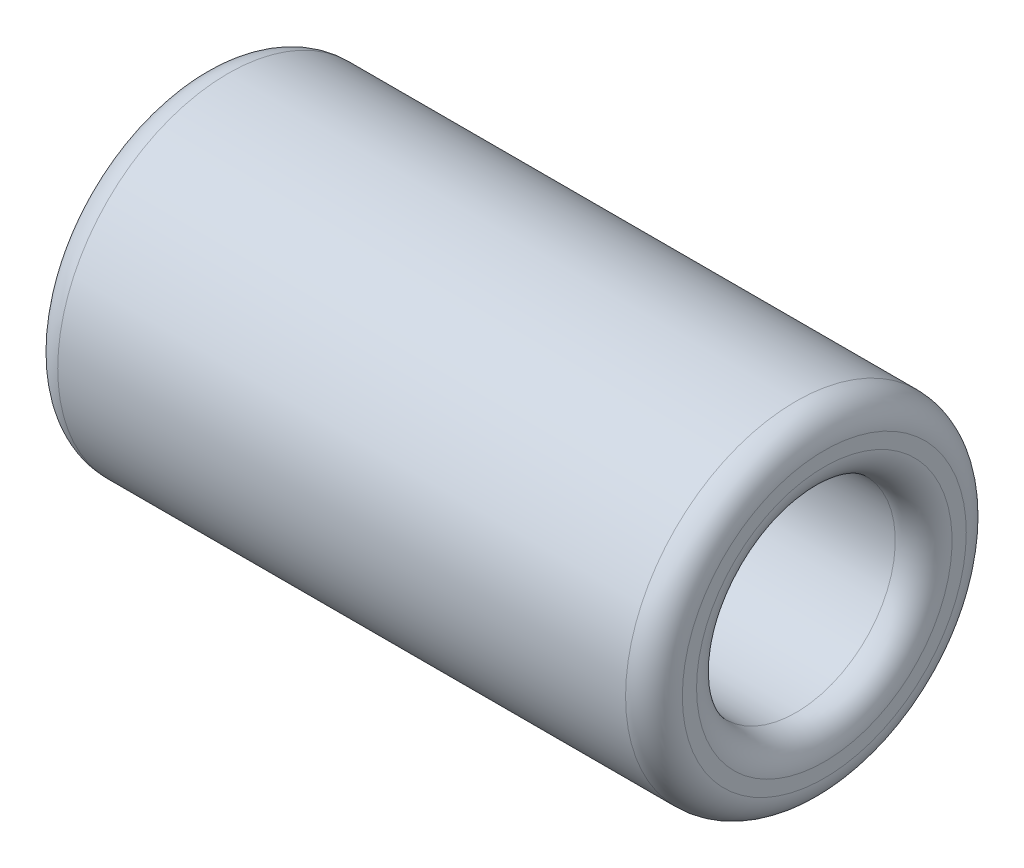
ISO-10303-21;
HEADER;
FILE_DESCRIPTION(('STEP AP214'),'2;1');
FILE_NAME('part.step','',(''),(''),'','','');
FILE_SCHEMA(('AUTOMOTIVE_DESIGN { 1 0 10303 214 1 1 1 1 }'));
ENDSEC;
DATA;
#1=APPLICATION_CONTEXT('core data for automotive mechanical design processes');
#2=APPLICATION_PROTOCOL_DEFINITION('international standard','automotive_design',2000,#1);
#3=PRODUCT_CONTEXT('',#1,'mechanical');
#4=PRODUCT('Part','Part','',(#3));
#5=PRODUCT_RELATED_PRODUCT_CATEGORY('part','',(#4));
#6=PRODUCT_DEFINITION_FORMATION('','',#4);
#7=PRODUCT_DEFINITION_CONTEXT('part definition',#1,'design');
#8=PRODUCT_DEFINITION('design','',#6,#7);
#9=PRODUCT_DEFINITION_SHAPE('','',#8);
#10=(LENGTH_UNIT() NAMED_UNIT(*) SI_UNIT(.MILLI.,.METRE.));
#11=(NAMED_UNIT(*) PLANE_ANGLE_UNIT() SI_UNIT($,.RADIAN.));
#12=(NAMED_UNIT(*) SI_UNIT($,.STERADIAN.) SOLID_ANGLE_UNIT());
#13=UNCERTAINTY_MEASURE_WITH_UNIT(LENGTH_MEASURE(1.E-05),#10,'distance_accuracy_value','');
#14=(GEOMETRIC_REPRESENTATION_CONTEXT(3) GLOBAL_UNCERTAINTY_ASSIGNED_CONTEXT((#13)) GLOBAL_UNIT_ASSIGNED_CONTEXT((#10,
#11,#12)) REPRESENTATION_CONTEXT('',''));
#15=CARTESIAN_POINT('',(0.,0.,0.));
#16=DIRECTION('',(0.,0.,1.));
#17=DIRECTION('',(1.,0.,0.));
#18=AXIS2_PLACEMENT_3D('',#15,#16,#17);
#19=CARTESIAN_POINT('',(0.,3.,0.));
#20=DIRECTION('',(1.,0.,0.));
#21=DIRECTION('',(0.,0.,-1.));
#22=AXIS2_PLACEMENT_3D('',#19,#20,#21);
#23=PLANE('',#22);
#24=CARTESIAN_POINT('',(0.,0.,0.));
#25=DIRECTION('',(1.,0.,0.));
#26=DIRECTION('',(0.,0.,-1.));
#27=AXIS2_PLACEMENT_3D('',#24,#25,#26);
#28=CIRCLE('',#27,2.5);
#29=CARTESIAN_POINT('',(0.,0.,-2.5));
#30=VERTEX_POINT('',#29);
#31=EDGE_CURVE('E53',#30,#30,#28,.F.);
#32=ORIENTED_EDGE('',*,*,#31,.T.);
#33=EDGE_LOOP('',(#32));
#34=FACE_BOUND('',#33,.T.);
#35=CARTESIAN_POINT('',(0.,0.,0.));
#36=DIRECTION('',(-1.,0.,0.));
#37=DIRECTION('',(0.,0.,1.));
#38=AXIS2_PLACEMENT_3D('',#35,#36,#37);
#39=CIRCLE('',#38,1.9);
#40=CARTESIAN_POINT('',(0.,0.,1.9));
#41=VERTEX_POINT('',#40);
#42=EDGE_CURVE('E56',#41,#41,#39,.T.);
#43=ORIENTED_EDGE('',*,*,#42,.F.);
#44=EDGE_LOOP('',(#43));
#45=FACE_BOUND('',#44,.T.);
#46=ADVANCED_FACE('F30',(#34,#45),#23,.F.);
#47=CARTESIAN_POINT('',(0.,0.,0.));
#48=DIRECTION('',(-1.,0.,0.));
#49=DIRECTION('',(0.,0.,1.));
#50=AXIS2_PLACEMENT_3D('',#47,#48,#49);
#51=CYLINDRICAL_SURFACE('',#50,1.9);
#52=CARTESIAN_POINT('',(8.,0.,0.));
#53=DIRECTION('',(-1.,0.,0.));
#54=DIRECTION('',(0.,0.,1.));
#55=AXIS2_PLACEMENT_3D('',#52,#53,#54);
#56=CIRCLE('',#55,1.9);
#57=CARTESIAN_POINT('',(8.,0.,1.9));
#58=VERTEX_POINT('',#57);
#59=EDGE_CURVE('E59',#58,#58,#56,.T.);
#60=ORIENTED_EDGE('',*,*,#59,.F.);
#61=EDGE_LOOP('',(#60));
#62=FACE_BOUND('',#61,.T.);
#63=ORIENTED_EDGE('',*,*,#42,.T.);
#64=EDGE_LOOP('',(#63));
#65=FACE_BOUND('',#64,.T.);
#66=ADVANCED_FACE('F71',(#62,#65),#51,.F.);
#67=CARTESIAN_POINT('',(8.,0.,0.));
#68=DIRECTION('',(-1.,0.,0.));
#69=DIRECTION('',(0.,0.,1.));
#70=AXIS2_PLACEMENT_3D('',#67,#68,#69);
#71=CONICAL_SURFACE('',#70,1.9,1.02974425867666);
#72=CARTESIAN_POINT('',(8.09012909285413,0.,0.));
#73=DIRECTION('',(-1.,0.,0.));
#74=DIRECTION('',(0.,0.,1.));
#75=AXIS2_PLACEMENT_3D('',#72,#73,#74);
#76=CIRCLE('',#75,1.75);
#77=CARTESIAN_POINT('',(8.09012909285413,0.,1.75));
#78=VERTEX_POINT('',#77);
#79=EDGE_CURVE('E62',#78,#78,#76,.T.);
#80=ORIENTED_EDGE('',*,*,#79,.F.);
#81=EDGE_LOOP('',(#80));
#82=FACE_BOUND('',#81,.T.);
#83=ORIENTED_EDGE('',*,*,#59,.T.);
#84=EDGE_LOOP('',(#83));
#85=FACE_BOUND('',#84,.T.);
#86=ADVANCED_FACE('F68',(#82,#85),#71,.F.);
#87=CARTESIAN_POINT('',(0.,0.,0.));
#88=DIRECTION('',(-1.,0.,0.));
#89=DIRECTION('',(0.,0.,1.));
#90=AXIS2_PLACEMENT_3D('',#87,#88,#89);
#91=CYLINDRICAL_SURFACE('',#90,1.75);
#92=CARTESIAN_POINT('',(10.5,0.,0.));
#93=DIRECTION('',(-1.,0.,0.));
#94=DIRECTION('',(0.,0.,1.));
#95=AXIS2_PLACEMENT_3D('',#92,#93,#94);
#96=CIRCLE('',#95,1.75);
#97=CARTESIAN_POINT('',(10.5,0.,1.75));
#98=VERTEX_POINT('',#97);
#99=EDGE_CURVE('E10',#98,#98,#96,.F.);
#100=ORIENTED_EDGE('',*,*,#99,.T.);
#101=EDGE_LOOP('',(#100));
#102=FACE_BOUND('',#101,.T.);
#103=ORIENTED_EDGE('',*,*,#79,.T.);
#104=EDGE_LOOP('',(#103));
#105=FACE_BOUND('',#104,.T.);
#106=ADVANCED_FACE('F66',(#102,#105),#91,.F.);
#107=CARTESIAN_POINT('',(11.,3.,0.));
#108=DIRECTION('',(-1.,0.,0.));
#109=DIRECTION('',(0.,0.,1.));
#110=AXIS2_PLACEMENT_3D('',#107,#108,#109);
#111=PLANE('',#110);
#112=CARTESIAN_POINT('',(11.,0.,0.));
#113=DIRECTION('',(-1.,0.,0.));
#114=DIRECTION('',(0.,0.,1.));
#115=AXIS2_PLACEMENT_3D('',#112,#113,#114);
#116=CIRCLE('',#115,2.25);
#117=CARTESIAN_POINT('',(11.,0.,2.25));
#118=VERTEX_POINT('',#117);
#119=EDGE_CURVE('E37',#118,#118,#116,.T.);
#120=ORIENTED_EDGE('',*,*,#119,.T.);
#121=EDGE_LOOP('',(#120));
#122=FACE_BOUND('',#121,.T.);
#123=CARTESIAN_POINT('',(11.,0.,0.));
#124=DIRECTION('',(-1.,0.,0.));
#125=DIRECTION('',(0.,0.,1.));
#126=AXIS2_PLACEMENT_3D('',#123,#124,#125);
#127=CIRCLE('',#126,2.5);
#128=CARTESIAN_POINT('',(11.,0.,2.5));
#129=VERTEX_POINT('',#128);
#130=EDGE_CURVE('E41',#129,#129,#127,.F.);
#131=ORIENTED_EDGE('',*,*,#130,.T.);
#132=EDGE_LOOP('',(#131));
#133=FACE_BOUND('',#132,.T.);
#134=ADVANCED_FACE('F105',(#122,#133),#111,.F.);
#135=CARTESIAN_POINT('',(0.,0.,0.));
#136=DIRECTION('',(-1.,0.,0.));
#137=DIRECTION('',(0.,0.,1.));
#138=AXIS2_PLACEMENT_3D('',#135,#136,#137);
#139=CYLINDRICAL_SURFACE('',#138,3.);
#140=CARTESIAN_POINT('',(0.5,0.,0.));
#141=DIRECTION('',(1.,0.,0.));
#142=DIRECTION('',(0.,0.,-1.));
#143=AXIS2_PLACEMENT_3D('',#140,#141,#142);
#144=CIRCLE('',#143,3.);
#145=CARTESIAN_POINT('',(0.5,0.,-3.));
#146=VERTEX_POINT('',#145);
#147=EDGE_CURVE('E45',#146,#146,#144,.T.);
#148=ORIENTED_EDGE('',*,*,#147,.T.);
#149=EDGE_LOOP('',(#148));
#150=FACE_BOUND('',#149,.T.);
#151=CARTESIAN_POINT('',(10.5,0.,0.));
#152=DIRECTION('',(-1.,0.,0.));
#153=DIRECTION('',(0.,0.,1.));
#154=AXIS2_PLACEMENT_3D('',#151,#152,#153);
#155=CIRCLE('',#154,3.);
#156=CARTESIAN_POINT('',(10.5,0.,3.));
#157=VERTEX_POINT('',#156);
#158=EDGE_CURVE('E50',#157,#157,#155,.T.);
#159=ORIENTED_EDGE('',*,*,#158,.T.);
#160=EDGE_LOOP('',(#159));
#161=FACE_BOUND('',#160,.T.);
#162=ADVANCED_FACE('F89',(#150,#161),#139,.T.);
#163=CARTESIAN_POINT('',(0.5,0.,0.));
#164=DIRECTION('',(1.,0.,0.));
#165=DIRECTION('',(0.,0.,-1.));
#166=AXIS2_PLACEMENT_3D('',#163,#164,#165);
#167=TOROIDAL_SURFACE('',#166,2.5,0.5);
#168=ORIENTED_EDGE('',*,*,#147,.F.);
#169=EDGE_LOOP('',(#168));
#170=FACE_BOUND('',#169,.T.);
#171=ORIENTED_EDGE('',*,*,#31,.F.);
#172=EDGE_LOOP('',(#171));
#173=FACE_BOUND('',#172,.T.);
#174=ADVANCED_FACE('F86',(#170,#173),#167,.T.);
#175=CARTESIAN_POINT('',(10.5,0.,0.));
#176=DIRECTION('',(-1.,0.,0.));
#177=DIRECTION('',(0.,0.,1.));
#178=AXIS2_PLACEMENT_3D('',#175,#176,#177);
#179=TOROIDAL_SURFACE('',#178,2.25,0.5);
#180=ORIENTED_EDGE('',*,*,#99,.F.);
#181=EDGE_LOOP('',(#180));
#182=FACE_BOUND('',#181,.T.);
#183=ORIENTED_EDGE('',*,*,#119,.F.);
#184=EDGE_LOOP('',(#183));
#185=FACE_BOUND('',#184,.T.);
#186=ADVANCED_FACE('F88',(#182,#185),#179,.T.);
#187=CARTESIAN_POINT('',(10.5,0.,0.));
#188=DIRECTION('',(-1.,0.,0.));
#189=DIRECTION('',(0.,0.,1.));
#190=AXIS2_PLACEMENT_3D('',#187,#188,#189);
#191=TOROIDAL_SURFACE('',#190,2.5,0.5);
#192=ORIENTED_EDGE('',*,*,#130,.F.);
#193=EDGE_LOOP('',(#192));
#194=FACE_BOUND('',#193,.T.);
#195=ORIENTED_EDGE('',*,*,#158,.F.);
#196=EDGE_LOOP('',(#195));
#197=FACE_BOUND('',#196,.T.);
#198=ADVANCED_FACE('F32',(#194,#197),#191,.T.);
#199=CLOSED_SHELL('',(#46,#66,#86,#106,#134,#162,#174,#186,#198));
#200=MANIFOLD_SOLID_BREP('B2',#199);
#201=ADVANCED_BREP_SHAPE_REPRESENTATION('',(#18,#200),#14);
#202=SHAPE_DEFINITION_REPRESENTATION(#9,#201);
ENDSEC;
END-ISO-10303-21;
